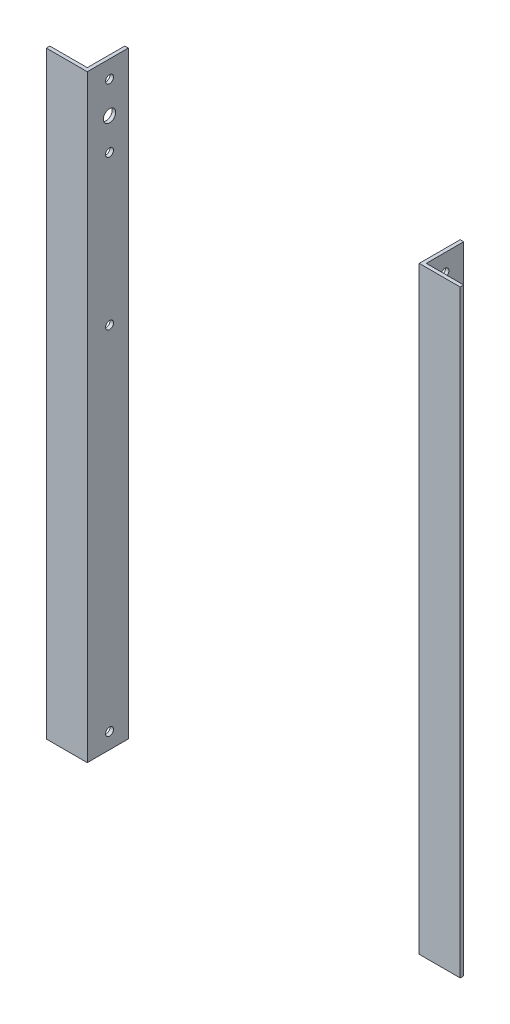
ISO-10303-21;
HEADER;
FILE_DESCRIPTION(('STEP AP214'),'2;1');
FILE_NAME('part.step','',(''),(''),'','','');
FILE_SCHEMA(('AUTOMOTIVE_DESIGN { 1 0 10303 214 1 1 1 1 }'));
ENDSEC;
DATA;
#1=APPLICATION_CONTEXT('core data for automotive mechanical design processes');
#2=APPLICATION_PROTOCOL_DEFINITION('international standard','automotive_design',2000,#1);
#3=PRODUCT_CONTEXT('',#1,'mechanical');
#4=PRODUCT('Part','Part','',(#3));
#5=PRODUCT_RELATED_PRODUCT_CATEGORY('part','',(#4));
#6=PRODUCT_DEFINITION_FORMATION('','',#4);
#7=PRODUCT_DEFINITION_CONTEXT('part definition',#1,'design');
#8=PRODUCT_DEFINITION('design','',#6,#7);
#9=PRODUCT_DEFINITION_SHAPE('','',#8);
#10=(LENGTH_UNIT() NAMED_UNIT(*) SI_UNIT(.MILLI.,.METRE.));
#11=(NAMED_UNIT(*) PLANE_ANGLE_UNIT() SI_UNIT($,.RADIAN.));
#12=(NAMED_UNIT(*) SI_UNIT($,.STERADIAN.) SOLID_ANGLE_UNIT());
#13=UNCERTAINTY_MEASURE_WITH_UNIT(LENGTH_MEASURE(1.E-05),#10,'distance_accuracy_value','');
#14=(GEOMETRIC_REPRESENTATION_CONTEXT(3) GLOBAL_UNCERTAINTY_ASSIGNED_CONTEXT((#13)) GLOBAL_UNIT_ASSIGNED_CONTEXT((#10,
#11,#12)) REPRESENTATION_CONTEXT('',''));
#15=CARTESIAN_POINT('',(0.,0.,0.));
#16=DIRECTION('',(0.,0.,1.));
#17=DIRECTION('',(1.,0.,0.));
#18=AXIS2_PLACEMENT_3D('',#15,#16,#17);
#19=CARTESIAN_POINT('',(190.6,340.,-2.));
#20=DIRECTION('',(0.,0.,1.));
#21=DIRECTION('',(1.,0.,0.));
#22=AXIS2_PLACEMENT_3D('',#19,#20,#21);
#23=PLANE('',#22);
#24=DIRECTION('',(-1.,0.,0.));
#25=VECTOR('',#24,1.);
#26=CARTESIAN_POINT('',(190.6,0.,-2.));
#27=LINE('',#26,#25);
#28=CARTESIAN_POINT('',(211.9,0.,-2.));
#29=VERTEX_POINT('',#28);
#30=CARTESIAN_POINT('',(190.6,0.,-2.));
#31=VERTEX_POINT('',#30);
#32=EDGE_CURVE('E132',#29,#31,#27,.T.);
#33=ORIENTED_EDGE('',*,*,#32,.T.);
#34=DIRECTION('',(0.,-1.,0.));
#35=VECTOR('',#34,1.);
#36=CARTESIAN_POINT('',(190.6,340.,-2.));
#37=LINE('',#36,#35);
#38=CARTESIAN_POINT('',(190.6,340.,-2.));
#39=VERTEX_POINT('',#38);
#40=EDGE_CURVE('E12',#39,#31,#37,.T.);
#41=ORIENTED_EDGE('',*,*,#40,.F.);
#42=DIRECTION('',(-1.,0.,0.));
#43=VECTOR('',#42,1.);
#44=CARTESIAN_POINT('',(190.6,340.,-2.));
#45=LINE('',#44,#43);
#46=CARTESIAN_POINT('',(211.9,340.,-2.));
#47=VERTEX_POINT('',#46);
#48=EDGE_CURVE('E143',#47,#39,#45,.T.);
#49=ORIENTED_EDGE('',*,*,#48,.F.);
#50=DIRECTION('',(0.,-1.,0.));
#51=VECTOR('',#50,1.);
#52=CARTESIAN_POINT('',(211.9,340.,-2.));
#53=LINE('',#52,#51);
#54=EDGE_CURVE('E128',#47,#29,#53,.T.);
#55=ORIENTED_EDGE('',*,*,#54,.T.);
#56=EDGE_LOOP('',(#33,#41,#49,#55));
#57=FACE_BOUND('',#56,.T.);
#58=ADVANCED_FACE('F46',(#57),#23,.F.);
#59=CARTESIAN_POINT('',(190.6,340.,-23.3));
#60=DIRECTION('',(-1.,0.,0.));
#61=DIRECTION('',(0.,0.,1.));
#62=AXIS2_PLACEMENT_3D('',#59,#60,#61);
#63=PLANE('',#62);
#64=CARTESIAN_POINT('',(190.6,330.,-12.65));
#65=DIRECTION('',(-1.,0.,0.));
#66=DIRECTION('',(0.,0.,1.));
#67=AXIS2_PLACEMENT_3D('',#64,#65,#66);
#68=CIRCLE('',#67,2.25);
#69=CARTESIAN_POINT('',(190.6,330.,-10.4));
#70=VERTEX_POINT('',#69);
#71=EDGE_CURVE('E171',#70,#70,#68,.T.);
#72=ORIENTED_EDGE('',*,*,#71,.T.);
#73=EDGE_LOOP('',(#72));
#74=FACE_BOUND('',#73,.T.);
#75=CARTESIAN_POINT('',(190.6,294.,-12.65));
#76=DIRECTION('',(-1.,0.,0.));
#77=DIRECTION('',(0.,0.,1.));
#78=AXIS2_PLACEMENT_3D('',#75,#76,#77);
#79=CIRCLE('',#78,2.25);
#80=CARTESIAN_POINT('',(190.6,294.,-10.4));
#81=VERTEX_POINT('',#80);
#82=EDGE_CURVE('E161',#81,#81,#79,.T.);
#83=ORIENTED_EDGE('',*,*,#82,.T.);
#84=EDGE_LOOP('',(#83));
#85=FACE_BOUND('',#84,.T.);
#86=CARTESIAN_POINT('',(190.6,312.,-12.65));
#87=DIRECTION('',(-1.,0.,0.));
#88=DIRECTION('',(0.,0.,1.));
#89=AXIS2_PLACEMENT_3D('',#86,#87,#88);
#90=CIRCLE('',#89,3.5);
#91=CARTESIAN_POINT('',(190.6,312.,-9.15));
#92=VERTEX_POINT('',#91);
#93=EDGE_CURVE('E158',#92,#92,#90,.T.);
#94=ORIENTED_EDGE('',*,*,#93,.T.);
#95=EDGE_LOOP('',(#94));
#96=FACE_BOUND('',#95,.T.);
#97=CARTESIAN_POINT('',(190.6,209.,-12.65));
#98=DIRECTION('',(1.,0.,0.));
#99=DIRECTION('',(0.,0.,-1.));
#100=AXIS2_PLACEMENT_3D('',#97,#98,#99);
#101=CIRCLE('',#100,2.25);
#102=CARTESIAN_POINT('',(190.6,209.,-14.9));
#103=VERTEX_POINT('',#102);
#104=EDGE_CURVE('E155',#103,#103,#101,.T.);
#105=ORIENTED_EDGE('',*,*,#104,.F.);
#106=EDGE_LOOP('',(#105));
#107=FACE_BOUND('',#106,.T.);
#108=CARTESIAN_POINT('',(190.6,9.,-12.65));
#109=DIRECTION('',(1.,0.,0.));
#110=DIRECTION('',(0.,0.,-1.));
#111=AXIS2_PLACEMENT_3D('',#108,#109,#110);
#112=CIRCLE('',#111,2.25);
#113=CARTESIAN_POINT('',(190.6,9.,-14.9));
#114=VERTEX_POINT('',#113);
#115=EDGE_CURVE('E151',#114,#114,#112,.T.);
#116=ORIENTED_EDGE('',*,*,#115,.F.);
#117=EDGE_LOOP('',(#116));
#118=FACE_BOUND('',#117,.T.);
#119=DIRECTION('',(0.,0.,-1.));
#120=VECTOR('',#119,1.);
#121=CARTESIAN_POINT('',(190.6,0.,-23.3));
#122=LINE('',#121,#120);
#123=CARTESIAN_POINT('',(190.6,0.,-23.3));
#124=VERTEX_POINT('',#123);
#125=EDGE_CURVE('E135',#31,#124,#122,.T.);
#126=ORIENTED_EDGE('',*,*,#125,.T.);
#127=DIRECTION('',(0.,-1.,0.));
#128=VECTOR('',#127,1.);
#129=CARTESIAN_POINT('',(190.6,340.,-23.3));
#130=LINE('',#129,#128);
#131=CARTESIAN_POINT('',(190.6,340.,-23.3));
#132=VERTEX_POINT('',#131);
#133=EDGE_CURVE('E55',#132,#124,#130,.T.);
#134=ORIENTED_EDGE('',*,*,#133,.F.);
#135=DIRECTION('',(0.,0.,-1.));
#136=VECTOR('',#135,1.);
#137=CARTESIAN_POINT('',(190.6,340.,-23.3));
#138=LINE('',#137,#136);
#139=EDGE_CURVE('E101',#39,#132,#138,.T.);
#140=ORIENTED_EDGE('',*,*,#139,.F.);
#141=ORIENTED_EDGE('',*,*,#40,.T.);
#142=EDGE_LOOP('',(#126,#134,#140,#141));
#143=FACE_BOUND('',#142,.T.);
#144=ADVANCED_FACE('F181',(#74,#85,#96,#107,#118,#143),#63,.F.);
#145=CARTESIAN_POINT('',(188.6,340.,-23.3));
#146=DIRECTION('',(0.,0.,1.));
#147=DIRECTION('',(1.,0.,0.));
#148=AXIS2_PLACEMENT_3D('',#145,#146,#147);
#149=PLANE('',#148);
#150=DIRECTION('',(-1.,0.,0.));
#151=VECTOR('',#150,1.);
#152=CARTESIAN_POINT('',(188.6,0.,-23.3));
#153=LINE('',#152,#151);
#154=CARTESIAN_POINT('',(188.6,0.,-23.3));
#155=VERTEX_POINT('',#154);
#156=EDGE_CURVE('E138',#124,#155,#153,.T.);
#157=ORIENTED_EDGE('',*,*,#156,.T.);
#158=DIRECTION('',(0.,-1.,0.));
#159=VECTOR('',#158,1.);
#160=CARTESIAN_POINT('',(188.6,340.,-23.3));
#161=LINE('',#160,#159);
#162=CARTESIAN_POINT('',(188.6,340.,-23.3));
#163=VERTEX_POINT('',#162);
#164=EDGE_CURVE('E123',#163,#155,#161,.T.);
#165=ORIENTED_EDGE('',*,*,#164,.F.);
#166=DIRECTION('',(-1.,0.,0.));
#167=VECTOR('',#166,1.);
#168=CARTESIAN_POINT('',(188.6,340.,-23.3));
#169=LINE('',#168,#167);
#170=EDGE_CURVE('E114',#132,#163,#169,.T.);
#171=ORIENTED_EDGE('',*,*,#170,.F.);
#172=ORIENTED_EDGE('',*,*,#133,.T.);
#173=EDGE_LOOP('',(#157,#165,#171,#172));
#174=FACE_BOUND('',#173,.T.);
#175=ADVANCED_FACE('F184',(#174),#149,.F.);
#176=CARTESIAN_POINT('',(188.6,340.,0.));
#177=DIRECTION('',(1.,0.,0.));
#178=DIRECTION('',(0.,0.,-1.));
#179=AXIS2_PLACEMENT_3D('',#176,#177,#178);
#180=PLANE('',#179);
#181=CARTESIAN_POINT('',(188.6,330.,-12.65));
#182=DIRECTION('',(1.,0.,0.));
#183=DIRECTION('',(0.,0.,-1.));
#184=AXIS2_PLACEMENT_3D('',#181,#182,#183);
#185=CIRCLE('',#184,2.25);
#186=CARTESIAN_POINT('',(188.6,330.,-14.9));
#187=VERTEX_POINT('',#186);
#188=EDGE_CURVE('E49',#187,#187,#185,.T.);
#189=ORIENTED_EDGE('',*,*,#188,.T.);
#190=EDGE_LOOP('',(#189));
#191=FACE_BOUND('',#190,.T.);
#192=CARTESIAN_POINT('',(188.6,294.,-12.65));
#193=DIRECTION('',(1.,0.,0.));
#194=DIRECTION('',(0.,0.,-1.));
#195=AXIS2_PLACEMENT_3D('',#192,#193,#194);
#196=CIRCLE('',#195,2.25);
#197=CARTESIAN_POINT('',(188.6,294.,-14.9));
#198=VERTEX_POINT('',#197);
#199=EDGE_CURVE('E159',#198,#198,#196,.T.);
#200=ORIENTED_EDGE('',*,*,#199,.T.);
#201=EDGE_LOOP('',(#200));
#202=FACE_BOUND('',#201,.T.);
#203=CARTESIAN_POINT('',(188.6,312.,-12.65));
#204=DIRECTION('',(1.,0.,0.));
#205=DIRECTION('',(0.,0.,-1.));
#206=AXIS2_PLACEMENT_3D('',#203,#204,#205);
#207=CIRCLE('',#206,3.5);
#208=CARTESIAN_POINT('',(188.6,312.,-16.15));
#209=VERTEX_POINT('',#208);
#210=EDGE_CURVE('E156',#209,#209,#207,.T.);
#211=ORIENTED_EDGE('',*,*,#210,.T.);
#212=EDGE_LOOP('',(#211));
#213=FACE_BOUND('',#212,.T.);
#214=CARTESIAN_POINT('',(188.6,209.,-12.65));
#215=DIRECTION('',(1.,0.,0.));
#216=DIRECTION('',(0.,0.,-1.));
#217=AXIS2_PLACEMENT_3D('',#214,#215,#216);
#218=CIRCLE('',#217,2.25);
#219=CARTESIAN_POINT('',(188.6,209.,-14.9));
#220=VERTEX_POINT('',#219);
#221=EDGE_CURVE('E152',#220,#220,#218,.T.);
#222=ORIENTED_EDGE('',*,*,#221,.T.);
#223=EDGE_LOOP('',(#222));
#224=FACE_BOUND('',#223,.T.);
#225=CARTESIAN_POINT('',(188.6,9.,-12.65));
#226=DIRECTION('',(1.,0.,0.));
#227=DIRECTION('',(0.,0.,-1.));
#228=AXIS2_PLACEMENT_3D('',#225,#226,#227);
#229=CIRCLE('',#228,2.25);
#230=CARTESIAN_POINT('',(188.6,9.,-14.9));
#231=VERTEX_POINT('',#230);
#232=EDGE_CURVE('E136',#231,#231,#229,.T.);
#233=ORIENTED_EDGE('',*,*,#232,.T.);
#234=EDGE_LOOP('',(#233));
#235=FACE_BOUND('',#234,.T.);
#236=DIRECTION('',(0.,0.,1.));
#237=VECTOR('',#236,1.);
#238=CARTESIAN_POINT('',(188.6,0.,0.));
#239=LINE('',#238,#237);
#240=CARTESIAN_POINT('',(188.6,0.,0.));
#241=VERTEX_POINT('',#240);
#242=EDGE_CURVE('E122',#155,#241,#239,.T.);
#243=ORIENTED_EDGE('',*,*,#242,.T.);
#244=DIRECTION('',(0.,-1.,0.));
#245=VECTOR('',#244,1.);
#246=CARTESIAN_POINT('',(188.6,340.,0.));
#247=LINE('',#246,#245);
#248=CARTESIAN_POINT('',(188.6,340.,0.));
#249=VERTEX_POINT('',#248);
#250=EDGE_CURVE('E119',#249,#241,#247,.T.);
#251=ORIENTED_EDGE('',*,*,#250,.F.);
#252=DIRECTION('',(0.,0.,1.));
#253=VECTOR('',#252,1.);
#254=CARTESIAN_POINT('',(188.6,340.,0.));
#255=LINE('',#254,#253);
#256=EDGE_CURVE('E108',#163,#249,#255,.T.);
#257=ORIENTED_EDGE('',*,*,#256,.F.);
#258=ORIENTED_EDGE('',*,*,#164,.T.);
#259=EDGE_LOOP('',(#243,#251,#257,#258));
#260=FACE_BOUND('',#259,.T.);
#261=ADVANCED_FACE('F120',(#191,#202,#213,#224,#235,#260),#180,.F.);
#262=CARTESIAN_POINT('',(211.9,340.,0.));
#263=DIRECTION('',(0.,0.,-1.));
#264=DIRECTION('',(-1.,0.,0.));
#265=AXIS2_PLACEMENT_3D('',#262,#263,#264);
#266=PLANE('',#265);
#267=DIRECTION('',(1.,0.,0.));
#268=VECTOR('',#267,1.);
#269=CARTESIAN_POINT('',(211.9,0.,0.));
#270=LINE('',#269,#268);
#271=CARTESIAN_POINT('',(211.9,0.,0.));
#272=VERTEX_POINT('',#271);
#273=EDGE_CURVE('E87',#241,#272,#270,.T.);
#274=ORIENTED_EDGE('',*,*,#273,.T.);
#275=DIRECTION('',(0.,-1.,0.));
#276=VECTOR('',#275,1.);
#277=CARTESIAN_POINT('',(211.9,340.,0.));
#278=LINE('',#277,#276);
#279=CARTESIAN_POINT('',(211.9,340.,0.));
#280=VERTEX_POINT('',#279);
#281=EDGE_CURVE('E124',#280,#272,#278,.T.);
#282=ORIENTED_EDGE('',*,*,#281,.F.);
#283=DIRECTION('',(1.,0.,0.));
#284=VECTOR('',#283,1.);
#285=CARTESIAN_POINT('',(211.9,340.,0.));
#286=LINE('',#285,#284);
#287=EDGE_CURVE('E112',#249,#280,#286,.T.);
#288=ORIENTED_EDGE('',*,*,#287,.F.);
#289=ORIENTED_EDGE('',*,*,#250,.T.);
#290=EDGE_LOOP('',(#274,#282,#288,#289));
#291=FACE_BOUND('',#290,.T.);
#292=ADVANCED_FACE('F126',(#291),#266,.F.);
#293=CARTESIAN_POINT('',(211.9,340.,-2.));
#294=DIRECTION('',(-1.,0.,0.));
#295=DIRECTION('',(0.,0.,1.));
#296=AXIS2_PLACEMENT_3D('',#293,#294,#295);
#297=PLANE('',#296);
#298=DIRECTION('',(0.,0.,-1.));
#299=VECTOR('',#298,1.);
#300=CARTESIAN_POINT('',(211.9,0.,-2.));
#301=LINE('',#300,#299);
#302=EDGE_CURVE('E93',#272,#29,#301,.T.);
#303=ORIENTED_EDGE('',*,*,#302,.T.);
#304=ORIENTED_EDGE('',*,*,#54,.F.);
#305=DIRECTION('',(0.,0.,-1.));
#306=VECTOR('',#305,1.);
#307=CARTESIAN_POINT('',(211.9,340.,-2.));
#308=LINE('',#307,#306);
#309=EDGE_CURVE('E64',#280,#47,#308,.T.);
#310=ORIENTED_EDGE('',*,*,#309,.F.);
#311=ORIENTED_EDGE('',*,*,#281,.T.);
#312=EDGE_LOOP('',(#303,#304,#310,#311));
#313=FACE_BOUND('',#312,.T.);
#314=ADVANCED_FACE('F189',(#313),#297,.F.);
#315=CARTESIAN_POINT('',(0.,340.,0.));
#316=DIRECTION('',(0.,-1.,0.));
#317=DIRECTION('',(0.,0.,-1.));
#318=AXIS2_PLACEMENT_3D('',#315,#316,#317);
#319=PLANE('',#318);
#320=ORIENTED_EDGE('',*,*,#48,.T.);
#321=ORIENTED_EDGE('',*,*,#139,.T.);
#322=ORIENTED_EDGE('',*,*,#170,.T.);
#323=ORIENTED_EDGE('',*,*,#256,.T.);
#324=ORIENTED_EDGE('',*,*,#287,.T.);
#325=ORIENTED_EDGE('',*,*,#309,.T.);
#326=EDGE_LOOP('',(#320,#321,#322,#323,#324,#325));
#327=FACE_BOUND('',#326,.T.);
#328=ADVANCED_FACE('F110',(#327),#319,.F.);
#329=CARTESIAN_POINT('',(0.,0.,0.));
#330=DIRECTION('',(0.,-1.,0.));
#331=DIRECTION('',(0.,0.,-1.));
#332=AXIS2_PLACEMENT_3D('',#329,#330,#331);
#333=PLANE('',#332);
#334=ORIENTED_EDGE('',*,*,#32,.F.);
#335=ORIENTED_EDGE('',*,*,#302,.F.);
#336=ORIENTED_EDGE('',*,*,#273,.F.);
#337=ORIENTED_EDGE('',*,*,#242,.F.);
#338=ORIENTED_EDGE('',*,*,#156,.F.);
#339=ORIENTED_EDGE('',*,*,#125,.F.);
#340=EDGE_LOOP('',(#334,#335,#336,#337,#338,#339));
#341=FACE_BOUND('',#340,.T.);
#342=ADVANCED_FACE('F187',(#341),#333,.T.);
#343=CARTESIAN_POINT('',(-24.4,9.,-12.65));
#344=DIRECTION('',(1.,0.,0.));
#345=DIRECTION('',(0.,0.,-1.));
#346=AXIS2_PLACEMENT_3D('',#343,#344,#345);
#347=CYLINDRICAL_SURFACE('',#346,2.25);
#348=CARTESIAN_POINT('',(190.6,9.,-14.9));
#349=CARTESIAN_POINT('',(190.579166666667,9.,-14.9));
#350=CARTESIAN_POINT('',(190.558333333333,9.,-14.9));
#351=CARTESIAN_POINT('',(190.516666666667,9.,-14.9));
#352=CARTESIAN_POINT('',(190.495833333333,9.,-14.9));
#353=CARTESIAN_POINT('',(190.454166666667,9.,-14.9));
#354=CARTESIAN_POINT('',(190.433333333333,9.,-14.9));
#355=CARTESIAN_POINT('',(190.391666666667,9.,-14.9));
#356=CARTESIAN_POINT('',(190.370833333333,9.,-14.9));
#357=CARTESIAN_POINT('',(190.329166666667,9.,-14.9));
#358=CARTESIAN_POINT('',(190.308333333333,9.,-14.9));
#359=CARTESIAN_POINT('',(190.266666666667,9.,-14.9));
#360=CARTESIAN_POINT('',(190.245833333333,9.,-14.9));
#361=CARTESIAN_POINT('',(190.204166666667,9.,-14.9));
#362=CARTESIAN_POINT('',(190.183333333333,9.,-14.9));
#363=CARTESIAN_POINT('',(190.141666666667,9.,-14.9));
#364=CARTESIAN_POINT('',(190.120833333333,9.,-14.9));
#365=CARTESIAN_POINT('',(190.079166666667,9.,-14.9));
#366=CARTESIAN_POINT('',(190.058333333333,9.,-14.9));
#367=CARTESIAN_POINT('',(190.016666666667,9.,-14.9));
#368=CARTESIAN_POINT('',(189.995833333333,9.,-14.9));
#369=CARTESIAN_POINT('',(189.954166666667,9.,-14.9));
#370=CARTESIAN_POINT('',(189.933333333333,9.,-14.9));
#371=CARTESIAN_POINT('',(189.891666666667,9.,-14.9));
#372=CARTESIAN_POINT('',(189.870833333333,9.,-14.9));
#373=CARTESIAN_POINT('',(189.829166666667,9.,-14.9));
#374=CARTESIAN_POINT('',(189.808333333333,9.,-14.9));
#375=CARTESIAN_POINT('',(189.766666666667,9.,-14.9));
#376=CARTESIAN_POINT('',(189.745833333333,9.,-14.9));
#377=CARTESIAN_POINT('',(189.704166666667,9.,-14.9));
#378=CARTESIAN_POINT('',(189.683333333333,9.,-14.9));
#379=CARTESIAN_POINT('',(189.641666666667,9.,-14.9));
#380=CARTESIAN_POINT('',(189.620833333333,9.,-14.9));
#381=CARTESIAN_POINT('',(189.579166666667,9.,-14.9));
#382=CARTESIAN_POINT('',(189.558333333333,9.,-14.9));
#383=CARTESIAN_POINT('',(189.516666666667,9.,-14.9));
#384=CARTESIAN_POINT('',(189.495833333333,9.,-14.9));
#385=CARTESIAN_POINT('',(189.454166666667,9.,-14.9));
#386=CARTESIAN_POINT('',(189.433333333333,9.,-14.9));
#387=CARTESIAN_POINT('',(189.391666666667,9.,-14.9));
#388=CARTESIAN_POINT('',(189.370833333333,9.,-14.9));
#389=CARTESIAN_POINT('',(189.329166666667,9.,-14.9));
#390=CARTESIAN_POINT('',(189.308333333333,9.,-14.9));
#391=CARTESIAN_POINT('',(189.266666666667,9.,-14.9));
#392=CARTESIAN_POINT('',(189.245833333333,9.,-14.9));
#393=CARTESIAN_POINT('',(189.204166666667,9.,-14.9));
#394=CARTESIAN_POINT('',(189.183333333333,9.,-14.9));
#395=CARTESIAN_POINT('',(189.141666666667,9.,-14.9));
#396=CARTESIAN_POINT('',(189.120833333333,9.,-14.9));
#397=CARTESIAN_POINT('',(189.079166666667,9.,-14.9));
#398=CARTESIAN_POINT('',(189.058333333333,9.,-14.9));
#399=CARTESIAN_POINT('',(189.016666666667,9.,-14.9));
#400=CARTESIAN_POINT('',(188.995833333333,9.,-14.9));
#401=CARTESIAN_POINT('',(188.954166666667,9.,-14.9));
#402=CARTESIAN_POINT('',(188.933333333333,9.,-14.9));
#403=CARTESIAN_POINT('',(188.891666666667,9.,-14.9));
#404=CARTESIAN_POINT('',(188.870833333333,9.,-14.9));
#405=CARTESIAN_POINT('',(188.829166666667,9.,-14.9));
#406=CARTESIAN_POINT('',(188.808333333333,9.,-14.9));
#407=CARTESIAN_POINT('',(188.766666666667,9.,-14.9));
#408=CARTESIAN_POINT('',(188.745833333333,9.,-14.9));
#409=CARTESIAN_POINT('',(188.704166666667,9.,-14.9));
#410=CARTESIAN_POINT('',(188.683333333333,9.,-14.9));
#411=CARTESIAN_POINT('',(188.641666666667,9.,-14.9));
#412=CARTESIAN_POINT('',(188.620833333333,9.,-14.9));
#413=CARTESIAN_POINT('',(188.6,9.,-14.9));
#414=B_SPLINE_CURVE_WITH_KNOTS('',3,(#348,#349,#350,#351,#352,#353,#354,#355,#356,#357,#358,
#359,#360,#361,#362,#363,#364,#365,#366,#367,#368,#369,#370,#371,#372,#373,#374,#375,#376,#377,
#378,#379,#380,#381,#382,#383,#384,#385,#386,#387,#388,#389,#390,#391,#392,#393,#394,#395,#396,
#397,#398,#399,#400,#401,#402,#403,#404,#405,#406,#407,#408,#409,#410,#411,#412,#413),
.UNSPECIFIED.,.F.,.F.,(4,2,2,2,2,2,2,2,2,2,2,2,2,2,2,2,2,2,2,2,2,2,2,2,2,2,2,2,2,2,2,2,4),(0.,
0.0624999999999931,0.124999999999986,0.187500000000007,0.25,0.312499999999993,0.375000000000014,
0.437500000000007,0.5,0.562499999999994,0.624999999999987,0.687500000000008,0.750000000000001,
0.812499999999994,0.875000000000015,0.937500000000008,1.,1.06249999999999,1.12499999999999,
1.18750000000001,1.25,1.31249999999999,1.37500000000002,1.43750000000001,1.5,1.56249999999999,
1.62499999999999,1.68750000000001,1.75,1.81249999999999,1.87500000000002,1.93750000000001,2.),.UNSPECIFIED.);
#415=EDGE_CURVE('BSEAM225',#114,#231,#414,.T.);
#416=ORIENTED_EDGE('',*,*,#115,.T.);
#417=ORIENTED_EDGE('',*,*,#232,.F.);
#418=ORIENTED_EDGE('',*,*,#415,.T.);
#419=ORIENTED_EDGE('',*,*,#415,.F.);
#420=EDGE_LOOP('',(#416,#418,#417,#419));
#421=FACE_BOUND('',#420,.T.);
#422=ADVANCED_FACE('F225',(#421),#347,.F.);
#423=CARTESIAN_POINT('',(-24.4,209.,-12.65));
#424=DIRECTION('',(1.,0.,0.));
#425=DIRECTION('',(0.,0.,-1.));
#426=AXIS2_PLACEMENT_3D('',#423,#424,#425);
#427=CYLINDRICAL_SURFACE('',#426,2.25);
#428=CARTESIAN_POINT('',(190.6,209.,-14.9));
#429=CARTESIAN_POINT('',(190.579166666667,209.,-14.9));
#430=CARTESIAN_POINT('',(190.558333333333,209.,-14.9));
#431=CARTESIAN_POINT('',(190.516666666667,209.,-14.9));
#432=CARTESIAN_POINT('',(190.495833333333,209.,-14.9));
#433=CARTESIAN_POINT('',(190.454166666667,209.,-14.9));
#434=CARTESIAN_POINT('',(190.433333333333,209.,-14.9));
#435=CARTESIAN_POINT('',(190.391666666667,209.,-14.9));
#436=CARTESIAN_POINT('',(190.370833333333,209.,-14.9));
#437=CARTESIAN_POINT('',(190.329166666667,209.,-14.9));
#438=CARTESIAN_POINT('',(190.308333333333,209.,-14.9));
#439=CARTESIAN_POINT('',(190.266666666667,209.,-14.9));
#440=CARTESIAN_POINT('',(190.245833333333,209.,-14.9));
#441=CARTESIAN_POINT('',(190.204166666667,209.,-14.9));
#442=CARTESIAN_POINT('',(190.183333333333,209.,-14.9));
#443=CARTESIAN_POINT('',(190.141666666667,209.,-14.9));
#444=CARTESIAN_POINT('',(190.120833333333,209.,-14.9));
#445=CARTESIAN_POINT('',(190.079166666667,209.,-14.9));
#446=CARTESIAN_POINT('',(190.058333333333,209.,-14.9));
#447=CARTESIAN_POINT('',(190.016666666667,209.,-14.9));
#448=CARTESIAN_POINT('',(189.995833333333,209.,-14.9));
#449=CARTESIAN_POINT('',(189.954166666667,209.,-14.9));
#450=CARTESIAN_POINT('',(189.933333333333,209.,-14.9));
#451=CARTESIAN_POINT('',(189.891666666667,209.,-14.9));
#452=CARTESIAN_POINT('',(189.870833333333,209.,-14.9));
#453=CARTESIAN_POINT('',(189.829166666667,209.,-14.9));
#454=CARTESIAN_POINT('',(189.808333333333,209.,-14.9));
#455=CARTESIAN_POINT('',(189.766666666667,209.,-14.9));
#456=CARTESIAN_POINT('',(189.745833333333,209.,-14.9));
#457=CARTESIAN_POINT('',(189.704166666667,209.,-14.9));
#458=CARTESIAN_POINT('',(189.683333333333,209.,-14.9));
#459=CARTESIAN_POINT('',(189.641666666667,209.,-14.9));
#460=CARTESIAN_POINT('',(189.620833333333,209.,-14.9));
#461=CARTESIAN_POINT('',(189.579166666667,209.,-14.9));
#462=CARTESIAN_POINT('',(189.558333333333,209.,-14.9));
#463=CARTESIAN_POINT('',(189.516666666667,209.,-14.9));
#464=CARTESIAN_POINT('',(189.495833333333,209.,-14.9));
#465=CARTESIAN_POINT('',(189.454166666667,209.,-14.9));
#466=CARTESIAN_POINT('',(189.433333333333,209.,-14.9));
#467=CARTESIAN_POINT('',(189.391666666667,209.,-14.9));
#468=CARTESIAN_POINT('',(189.370833333333,209.,-14.9));
#469=CARTESIAN_POINT('',(189.329166666667,209.,-14.9));
#470=CARTESIAN_POINT('',(189.308333333333,209.,-14.9));
#471=CARTESIAN_POINT('',(189.266666666667,209.,-14.9));
#472=CARTESIAN_POINT('',(189.245833333333,209.,-14.9));
#473=CARTESIAN_POINT('',(189.204166666667,209.,-14.9));
#474=CARTESIAN_POINT('',(189.183333333333,209.,-14.9));
#475=CARTESIAN_POINT('',(189.141666666667,209.,-14.9));
#476=CARTESIAN_POINT('',(189.120833333333,209.,-14.9));
#477=CARTESIAN_POINT('',(189.079166666667,209.,-14.9));
#478=CARTESIAN_POINT('',(189.058333333333,209.,-14.9));
#479=CARTESIAN_POINT('',(189.016666666667,209.,-14.9));
#480=CARTESIAN_POINT('',(188.995833333333,209.,-14.9));
#481=CARTESIAN_POINT('',(188.954166666667,209.,-14.9));
#482=CARTESIAN_POINT('',(188.933333333333,209.,-14.9));
#483=CARTESIAN_POINT('',(188.891666666667,209.,-14.9));
#484=CARTESIAN_POINT('',(188.870833333333,209.,-14.9));
#485=CARTESIAN_POINT('',(188.829166666667,209.,-14.9));
#486=CARTESIAN_POINT('',(188.808333333333,209.,-14.9));
#487=CARTESIAN_POINT('',(188.766666666667,209.,-14.9));
#488=CARTESIAN_POINT('',(188.745833333333,209.,-14.9));
#489=CARTESIAN_POINT('',(188.704166666667,209.,-14.9));
#490=CARTESIAN_POINT('',(188.683333333333,209.,-14.9));
#491=CARTESIAN_POINT('',(188.641666666667,209.,-14.9));
#492=CARTESIAN_POINT('',(188.620833333333,209.,-14.9));
#493=CARTESIAN_POINT('',(188.6,209.,-14.9));
#494=B_SPLINE_CURVE_WITH_KNOTS('',3,(#428,#429,#430,#431,#432,#433,#434,#435,#436,#437,#438,
#439,#440,#441,#442,#443,#444,#445,#446,#447,#448,#449,#450,#451,#452,#453,#454,#455,#456,#457,
#458,#459,#460,#461,#462,#463,#464,#465,#466,#467,#468,#469,#470,#471,#472,#473,#474,#475,#476,
#477,#478,#479,#480,#481,#482,#483,#484,#485,#486,#487,#488,#489,#490,#491,#492,#493),
.UNSPECIFIED.,.F.,.F.,(4,2,2,2,2,2,2,2,2,2,2,2,2,2,2,2,2,2,2,2,2,2,2,2,2,2,2,2,2,2,2,2,4),(0.,
0.0624999999999931,0.124999999999986,0.187500000000007,0.25,0.312499999999993,0.375000000000014,
0.437500000000007,0.5,0.562499999999994,0.624999999999987,0.687500000000008,0.750000000000001,
0.812499999999994,0.875000000000015,0.937500000000008,1.,1.06249999999999,1.12499999999999,
1.18750000000001,1.25,1.31249999999999,1.37500000000002,1.43750000000001,1.5,1.56249999999999,
1.62499999999999,1.68750000000001,1.75,1.81249999999999,1.87500000000002,1.93750000000001,2.),.UNSPECIFIED.);
#495=EDGE_CURVE('BSEAM227',#103,#220,#494,.T.);
#496=ORIENTED_EDGE('',*,*,#104,.T.);
#497=ORIENTED_EDGE('',*,*,#221,.F.);
#498=ORIENTED_EDGE('',*,*,#495,.T.);
#499=ORIENTED_EDGE('',*,*,#495,.F.);
#500=EDGE_LOOP('',(#496,#498,#497,#499));
#501=FACE_BOUND('',#500,.T.);
#502=ADVANCED_FACE('F227',(#501),#427,.F.);
#503=CARTESIAN_POINT('',(197.,312.,-12.65));
#504=DIRECTION('',(-1.,0.,0.));
#505=DIRECTION('',(0.,0.,1.));
#506=AXIS2_PLACEMENT_3D('',#503,#504,#505);
#507=CYLINDRICAL_SURFACE('',#506,3.5);
#508=ORIENTED_EDGE('',*,*,#210,.F.);
#509=EDGE_LOOP('',(#508));
#510=FACE_BOUND('',#509,.T.);
#511=ORIENTED_EDGE('',*,*,#93,.F.);
#512=EDGE_LOOP('',(#511));
#513=FACE_BOUND('',#512,.T.);
#514=ADVANCED_FACE('F234',(#510,#513),#507,.F.);
#515=CARTESIAN_POINT('',(197.,294.,-12.65));
#516=DIRECTION('',(-1.,0.,0.));
#517=DIRECTION('',(0.,0.,1.));
#518=AXIS2_PLACEMENT_3D('',#515,#516,#517);
#519=CYLINDRICAL_SURFACE('',#518,2.25);
#520=ORIENTED_EDGE('',*,*,#199,.F.);
#521=EDGE_LOOP('',(#520));
#522=FACE_BOUND('',#521,.T.);
#523=ORIENTED_EDGE('',*,*,#82,.F.);
#524=EDGE_LOOP('',(#523));
#525=FACE_BOUND('',#524,.T.);
#526=ADVANCED_FACE('F240',(#522,#525),#519,.F.);
#527=CARTESIAN_POINT('',(197.,330.,-12.65));
#528=DIRECTION('',(-1.,0.,0.));
#529=DIRECTION('',(0.,0.,1.));
#530=AXIS2_PLACEMENT_3D('',#527,#528,#529);
#531=CYLINDRICAL_SURFACE('',#530,2.25);
#532=ORIENTED_EDGE('',*,*,#188,.F.);
#533=EDGE_LOOP('',(#532));
#534=FACE_BOUND('',#533,.T.);
#535=ORIENTED_EDGE('',*,*,#71,.F.);
#536=EDGE_LOOP('',(#535));
#537=FACE_BOUND('',#536,.T.);
#538=ADVANCED_FACE('F244',(#534,#537),#531,.F.);
#539=CLOSED_SHELL('',(#58,#144,#175,#261,#292,#314,#328,#342,#422,#502,#514,#526,#538));
#540=MANIFOLD_SOLID_BREP('B2',#539);
#541=CARTESIAN_POINT('',(-23.3,340.,0.));
#542=DIRECTION('',(0.,0.,-1.));
#543=DIRECTION('',(-1.,0.,0.));
#544=AXIS2_PLACEMENT_3D('',#541,#542,#543);
#545=PLANE('',#544);
#546=DIRECTION('',(1.,0.,0.));
#547=VECTOR('',#546,1.);
#548=CARTESIAN_POINT('',(-23.3,0.,0.));
#549=LINE('',#548,#547);
#550=CARTESIAN_POINT('',(-23.3,0.,0.));
#551=VERTEX_POINT('',#550);
#552=CARTESIAN_POINT('',(0.,0.,0.));
#553=VERTEX_POINT('',#552);
#554=EDGE_CURVE('E412',#551,#553,#549,.T.);
#555=ORIENTED_EDGE('',*,*,#554,.T.);
#556=DIRECTION('',(0.,-1.,0.));
#557=VECTOR('',#556,1.);
#558=CARTESIAN_POINT('',(0.,340.,0.));
#559=LINE('',#558,#557);
#560=CARTESIAN_POINT('',(0.,340.,0.));
#561=VERTEX_POINT('',#560);
#562=EDGE_CURVE('E44',#561,#553,#559,.T.);
#563=ORIENTED_EDGE('',*,*,#562,.F.);
#564=DIRECTION('',(1.,0.,0.));
#565=VECTOR('',#564,1.);
#566=CARTESIAN_POINT('',(-23.3,340.,0.));
#567=LINE('',#566,#565);
#568=CARTESIAN_POINT('',(-23.3,340.,0.));
#569=VERTEX_POINT('',#568);
#570=EDGE_CURVE('E423',#569,#561,#567,.T.);
#571=ORIENTED_EDGE('',*,*,#570,.F.);
#572=DIRECTION('',(0.,-1.,0.));
#573=VECTOR('',#572,1.);
#574=CARTESIAN_POINT('',(-23.3,340.,0.));
#575=LINE('',#574,#573);
#576=EDGE_CURVE('E408',#569,#551,#575,.T.);
#577=ORIENTED_EDGE('',*,*,#576,.T.);
#578=EDGE_LOOP('',(#555,#563,#571,#577));
#579=FACE_BOUND('',#578,.T.);
#580=ADVANCED_FACE('F326',(#579),#545,.F.);
#581=CARTESIAN_POINT('',(0.,340.,0.));
#582=DIRECTION('',(-1.,0.,0.));
#583=DIRECTION('',(0.,0.,1.));
#584=AXIS2_PLACEMENT_3D('',#581,#582,#583);
#585=PLANE('',#584);
#586=CARTESIAN_POINT('',(0.,330.,-12.65));
#587=DIRECTION('',(-1.,0.,0.));
#588=DIRECTION('',(0.,0.,1.));
#589=AXIS2_PLACEMENT_3D('',#586,#587,#588);
#590=CIRCLE('',#589,2.25);
#591=CARTESIAN_POINT('',(0.,330.,-10.4));
#592=VERTEX_POINT('',#591);
#593=EDGE_CURVE('E440',#592,#592,#590,.T.);
#594=ORIENTED_EDGE('',*,*,#593,.T.);
#595=EDGE_LOOP('',(#594));
#596=FACE_BOUND('',#595,.T.);
#597=CARTESIAN_POINT('',(0.,294.,-12.65));
#598=DIRECTION('',(-1.,0.,0.));
#599=DIRECTION('',(0.,0.,1.));
#600=AXIS2_PLACEMENT_3D('',#597,#598,#599);
#601=CIRCLE('',#600,2.25);
#602=CARTESIAN_POINT('',(0.,294.,-10.4));
#603=VERTEX_POINT('',#602);
#604=EDGE_CURVE('E554',#603,#603,#601,.T.);
#605=ORIENTED_EDGE('',*,*,#604,.T.);
#606=EDGE_LOOP('',(#605));
#607=FACE_BOUND('',#606,.T.);
#608=CARTESIAN_POINT('',(0.,312.,-12.65));
#609=DIRECTION('',(-1.,0.,0.));
#610=DIRECTION('',(0.,0.,1.));
#611=AXIS2_PLACEMENT_3D('',#608,#609,#610);
#612=CIRCLE('',#611,3.5);
#613=CARTESIAN_POINT('',(0.,312.,-9.15));
#614=VERTEX_POINT('',#613);
#615=EDGE_CURVE('E556',#614,#614,#612,.T.);
#616=ORIENTED_EDGE('',*,*,#615,.T.);
#617=EDGE_LOOP('',(#616));
#618=FACE_BOUND('',#617,.T.);
#619=CARTESIAN_POINT('',(0.,209.,-12.65));
#620=DIRECTION('',(-1.,0.,0.));
#621=DIRECTION('',(0.,0.,1.));
#622=AXIS2_PLACEMENT_3D('',#619,#620,#621);
#623=CIRCLE('',#622,2.25);
#624=CARTESIAN_POINT('',(0.,209.,-14.9));
#625=VERTEX_POINT('',#624);
#626=EDGE_CURVE('E430',#625,#625,#623,.T.);
#627=ORIENTED_EDGE('',*,*,#626,.T.);
#628=EDGE_LOOP('',(#627));
#629=FACE_BOUND('',#628,.T.);
#630=CARTESIAN_POINT('',(0.,9.,-12.65));
#631=DIRECTION('',(-1.,0.,0.));
#632=DIRECTION('',(0.,0.,1.));
#633=AXIS2_PLACEMENT_3D('',#630,#631,#632);
#634=CIRCLE('',#633,2.25);
#635=CARTESIAN_POINT('',(0.,9.,-14.9));
#636=VERTEX_POINT('',#635);
#637=EDGE_CURVE('E416',#636,#636,#634,.T.);
#638=ORIENTED_EDGE('',*,*,#637,.T.);
#639=EDGE_LOOP('',(#638));
#640=FACE_BOUND('',#639,.T.);
#641=DIRECTION('',(0.,0.,-1.));
#642=VECTOR('',#641,1.);
#643=CARTESIAN_POINT('',(0.,0.,0.));
#644=LINE('',#643,#642);
#645=CARTESIAN_POINT('',(0.,0.,-23.3));
#646=VERTEX_POINT('',#645);
#647=EDGE_CURVE('E415',#553,#646,#644,.T.);
#648=ORIENTED_EDGE('',*,*,#647,.T.);
#649=DIRECTION('',(0.,-1.,0.));
#650=VECTOR('',#649,1.);
#651=CARTESIAN_POINT('',(0.,340.,-23.3));
#652=LINE('',#651,#650);
#653=CARTESIAN_POINT('',(0.,340.,-23.3));
#654=VERTEX_POINT('',#653);
#655=EDGE_CURVE('E335',#654,#646,#652,.T.);
#656=ORIENTED_EDGE('',*,*,#655,.F.);
#657=DIRECTION('',(0.,0.,-1.));
#658=VECTOR('',#657,1.);
#659=CARTESIAN_POINT('',(0.,340.,0.));
#660=LINE('',#659,#658);
#661=EDGE_CURVE('E381',#561,#654,#660,.T.);
#662=ORIENTED_EDGE('',*,*,#661,.F.);
#663=ORIENTED_EDGE('',*,*,#562,.T.);
#664=EDGE_LOOP('',(#648,#656,#662,#663));
#665=FACE_BOUND('',#664,.T.);
#666=ADVANCED_FACE('F447',(#596,#607,#618,#629,#640,#665),#585,.F.);
#667=CARTESIAN_POINT('',(0.,340.,-23.3));
#668=DIRECTION('',(0.,0.,1.));
#669=DIRECTION('',(1.,0.,0.));
#670=AXIS2_PLACEMENT_3D('',#667,#668,#669);
#671=PLANE('',#670);
#672=DIRECTION('',(-1.,0.,0.));
#673=VECTOR('',#672,1.);
#674=CARTESIAN_POINT('',(0.,0.,-23.3));
#675=LINE('',#674,#673);
#676=CARTESIAN_POINT('',(-2.,0.,-23.3));
#677=VERTEX_POINT('',#676);
#678=EDGE_CURVE('E418',#646,#677,#675,.T.);
#679=ORIENTED_EDGE('',*,*,#678,.T.);
#680=DIRECTION('',(0.,-1.,0.));
#681=VECTOR('',#680,1.);
#682=CARTESIAN_POINT('',(-2.,340.,-23.3));
#683=LINE('',#682,#681);
#684=CARTESIAN_POINT('',(-2.,340.,-23.3));
#685=VERTEX_POINT('',#684);
#686=EDGE_CURVE('E403',#685,#677,#683,.T.);
#687=ORIENTED_EDGE('',*,*,#686,.F.);
#688=DIRECTION('',(-1.,0.,0.));
#689=VECTOR('',#688,1.);
#690=CARTESIAN_POINT('',(0.,340.,-23.3));
#691=LINE('',#690,#689);
#692=EDGE_CURVE('E394',#654,#685,#691,.T.);
#693=ORIENTED_EDGE('',*,*,#692,.F.);
#694=ORIENTED_EDGE('',*,*,#655,.T.);
#695=EDGE_LOOP('',(#679,#687,#693,#694));
#696=FACE_BOUND('',#695,.T.);
#697=ADVANCED_FACE('F450',(#696),#671,.F.);
#698=CARTESIAN_POINT('',(-2.,340.,-23.3));
#699=DIRECTION('',(1.,0.,0.));
#700=DIRECTION('',(0.,0.,-1.));
#701=AXIS2_PLACEMENT_3D('',#698,#699,#700);
#702=PLANE('',#701);
#703=CARTESIAN_POINT('',(-2.,330.,-12.65));
#704=DIRECTION('',(-1.,0.,0.));
#705=DIRECTION('',(0.,0.,1.));
#706=AXIS2_PLACEMENT_3D('',#703,#704,#705);
#707=CIRCLE('',#706,2.25);
#708=CARTESIAN_POINT('',(-2.,330.,-10.4));
#709=VERTEX_POINT('',#708);
#710=EDGE_CURVE('E486',#709,#709,#707,.T.);
#711=ORIENTED_EDGE('',*,*,#710,.F.);
#712=EDGE_LOOP('',(#711));
#713=FACE_BOUND('',#712,.T.);
#714=CARTESIAN_POINT('',(-2.,294.,-12.65));
#715=DIRECTION('',(-1.,0.,0.));
#716=DIRECTION('',(0.,0.,1.));
#717=AXIS2_PLACEMENT_3D('',#714,#715,#716);
#718=CIRCLE('',#717,2.25);
#719=CARTESIAN_POINT('',(-2.,294.,-10.4));
#720=VERTEX_POINT('',#719);
#721=EDGE_CURVE('E490',#720,#720,#718,.T.);
#722=ORIENTED_EDGE('',*,*,#721,.F.);
#723=EDGE_LOOP('',(#722));
#724=FACE_BOUND('',#723,.T.);
#725=CARTESIAN_POINT('',(-2.,312.,-12.65));
#726=DIRECTION('',(-1.,0.,0.));
#727=DIRECTION('',(0.,0.,1.));
#728=AXIS2_PLACEMENT_3D('',#725,#726,#727);
#729=CIRCLE('',#728,3.5);
#730=CARTESIAN_POINT('',(-2.,312.,-9.15));
#731=VERTEX_POINT('',#730);
#732=EDGE_CURVE('E494',#731,#731,#729,.T.);
#733=ORIENTED_EDGE('',*,*,#732,.F.);
#734=EDGE_LOOP('',(#733));
#735=FACE_BOUND('',#734,.T.);
#736=CARTESIAN_POINT('',(-2.,209.,-12.65));
#737=DIRECTION('',(1.,0.,0.));
#738=DIRECTION('',(0.,0.,-1.));
#739=AXIS2_PLACEMENT_3D('',#736,#737,#738);
#740=CIRCLE('',#739,2.25);
#741=CARTESIAN_POINT('',(-2.00000000000001,209.,-14.9));
#742=VERTEX_POINT('',#741);
#743=EDGE_CURVE('E329',#742,#742,#740,.T.);
#744=ORIENTED_EDGE('',*,*,#743,.T.);
#745=EDGE_LOOP('',(#744));
#746=FACE_BOUND('',#745,.T.);
#747=CARTESIAN_POINT('',(-2.,9.,-12.65));
#748=DIRECTION('',(1.,0.,0.));
#749=DIRECTION('',(0.,0.,-1.));
#750=AXIS2_PLACEMENT_3D('',#747,#748,#749);
#751=CIRCLE('',#750,2.25);
#752=CARTESIAN_POINT('',(-2.00000000000001,9.,-14.9));
#753=VERTEX_POINT('',#752);
#754=EDGE_CURVE('E428',#753,#753,#751,.T.);
#755=ORIENTED_EDGE('',*,*,#754,.T.);
#756=EDGE_LOOP('',(#755));
#757=FACE_BOUND('',#756,.T.);
#758=DIRECTION('',(0.,0.,1.));
#759=VECTOR('',#758,1.);
#760=CARTESIAN_POINT('',(-2.,0.,-23.3));
#761=LINE('',#760,#759);
#762=CARTESIAN_POINT('',(-2.,0.,-2.));
#763=VERTEX_POINT('',#762);
#764=EDGE_CURVE('E402',#677,#763,#761,.T.);
#765=ORIENTED_EDGE('',*,*,#764,.T.);
#766=DIRECTION('',(0.,-1.,0.));
#767=VECTOR('',#766,1.);
#768=CARTESIAN_POINT('',(-2.,340.,-2.));
#769=LINE('',#768,#767);
#770=CARTESIAN_POINT('',(-2.,340.,-2.));
#771=VERTEX_POINT('',#770);
#772=EDGE_CURVE('E399',#771,#763,#769,.T.);
#773=ORIENTED_EDGE('',*,*,#772,.F.);
#774=DIRECTION('',(0.,0.,1.));
#775=VECTOR('',#774,1.);
#776=CARTESIAN_POINT('',(-2.,340.,-23.3));
#777=LINE('',#776,#775);
#778=EDGE_CURVE('E388',#685,#771,#777,.T.);
#779=ORIENTED_EDGE('',*,*,#778,.F.);
#780=ORIENTED_EDGE('',*,*,#686,.T.);
#781=EDGE_LOOP('',(#765,#773,#779,#780));
#782=FACE_BOUND('',#781,.T.);
#783=ADVANCED_FACE('F400',(#713,#724,#735,#746,#757,#782),#702,.F.);
#784=CARTESIAN_POINT('',(-2.,340.,-2.));
#785=DIRECTION('',(0.,0.,1.));
#786=DIRECTION('',(1.,0.,0.));
#787=AXIS2_PLACEMENT_3D('',#784,#785,#786);
#788=PLANE('',#787);
#789=DIRECTION('',(-1.,0.,0.));
#790=VECTOR('',#789,1.);
#791=CARTESIAN_POINT('',(-2.,0.,-2.));
#792=LINE('',#791,#790);
#793=CARTESIAN_POINT('',(-23.3,0.,-2.));
#794=VERTEX_POINT('',#793);
#795=EDGE_CURVE('E367',#763,#794,#792,.T.);
#796=ORIENTED_EDGE('',*,*,#795,.T.);
#797=DIRECTION('',(0.,-1.,0.));
#798=VECTOR('',#797,1.);
#799=CARTESIAN_POINT('',(-23.3,340.,-2.));
#800=LINE('',#799,#798);
#801=CARTESIAN_POINT('',(-23.3,340.,-2.));
#802=VERTEX_POINT('',#801);
#803=EDGE_CURVE('E404',#802,#794,#800,.T.);
#804=ORIENTED_EDGE('',*,*,#803,.F.);
#805=DIRECTION('',(-1.,0.,0.));
#806=VECTOR('',#805,1.);
#807=CARTESIAN_POINT('',(-2.,340.,-2.));
#808=LINE('',#807,#806);
#809=EDGE_CURVE('E392',#771,#802,#808,.T.);
#810=ORIENTED_EDGE('',*,*,#809,.F.);
#811=ORIENTED_EDGE('',*,*,#772,.T.);
#812=EDGE_LOOP('',(#796,#804,#810,#811));
#813=FACE_BOUND('',#812,.T.);
#814=ADVANCED_FACE('F406',(#813),#788,.F.);
#815=CARTESIAN_POINT('',(-23.3,340.,-2.));
#816=DIRECTION('',(1.,0.,0.));
#817=DIRECTION('',(0.,0.,-1.));
#818=AXIS2_PLACEMENT_3D('',#815,#816,#817);
#819=PLANE('',#818);
#820=DIRECTION('',(0.,0.,1.));
#821=VECTOR('',#820,1.);
#822=CARTESIAN_POINT('',(-23.3,0.,-2.));
#823=LINE('',#822,#821);
#824=EDGE_CURVE('E373',#794,#551,#823,.T.);
#825=ORIENTED_EDGE('',*,*,#824,.T.);
#826=ORIENTED_EDGE('',*,*,#576,.F.);
#827=DIRECTION('',(0.,0.,1.));
#828=VECTOR('',#827,1.);
#829=CARTESIAN_POINT('',(-23.3,340.,-2.));
#830=LINE('',#829,#828);
#831=EDGE_CURVE('E344',#802,#569,#830,.T.);
#832=ORIENTED_EDGE('',*,*,#831,.F.);
#833=ORIENTED_EDGE('',*,*,#803,.T.);
#834=EDGE_LOOP('',(#825,#826,#832,#833));
#835=FACE_BOUND('',#834,.T.);
#836=ADVANCED_FACE('F455',(#835),#819,.F.);
#837=CARTESIAN_POINT('',(0.,340.,0.));
#838=DIRECTION('',(0.,1.,0.));
#839=DIRECTION('',(0.,0.,1.));
#840=AXIS2_PLACEMENT_3D('',#837,#838,#839);
#841=PLANE('',#840);
#842=ORIENTED_EDGE('',*,*,#570,.T.);
#843=ORIENTED_EDGE('',*,*,#661,.T.);
#844=ORIENTED_EDGE('',*,*,#692,.T.);
#845=ORIENTED_EDGE('',*,*,#778,.T.);
#846=ORIENTED_EDGE('',*,*,#809,.T.);
#847=ORIENTED_EDGE('',*,*,#831,.T.);
#848=EDGE_LOOP('',(#842,#843,#844,#845,#846,#847));
#849=FACE_BOUND('',#848,.T.);
#850=ADVANCED_FACE('F390',(#849),#841,.T.);
#851=CARTESIAN_POINT('',(0.,0.,0.));
#852=DIRECTION('',(0.,1.,0.));
#853=DIRECTION('',(0.,0.,1.));
#854=AXIS2_PLACEMENT_3D('',#851,#852,#853);
#855=PLANE('',#854);
#856=ORIENTED_EDGE('',*,*,#554,.F.);
#857=ORIENTED_EDGE('',*,*,#824,.F.);
#858=ORIENTED_EDGE('',*,*,#795,.F.);
#859=ORIENTED_EDGE('',*,*,#764,.F.);
#860=ORIENTED_EDGE('',*,*,#678,.F.);
#861=ORIENTED_EDGE('',*,*,#647,.F.);
#862=EDGE_LOOP('',(#856,#857,#858,#859,#860,#861));
#863=FACE_BOUND('',#862,.T.);
#864=ADVANCED_FACE('F453',(#863),#855,.F.);
#865=CARTESIAN_POINT('',(-24.4,9.,-12.65));
#866=DIRECTION('',(1.,0.,0.));
#867=DIRECTION('',(0.,0.,-1.));
#868=AXIS2_PLACEMENT_3D('',#865,#866,#867);
#869=CYLINDRICAL_SURFACE('',#868,2.25);
#870=CARTESIAN_POINT('',(-2.00000000000001,9.,-14.9));
#871=CARTESIAN_POINT('',(-1.97916666666667,9.,-14.9));
#872=CARTESIAN_POINT('',(-1.95833333333334,9.,-14.9));
#873=CARTESIAN_POINT('',(-1.91666666666667,9.,-14.9));
#874=CARTESIAN_POINT('',(-1.89583333333334,9.,-14.9));
#875=CARTESIAN_POINT('',(-1.85416666666667,9.,-14.9));
#876=CARTESIAN_POINT('',(-1.83333333333334,9.,-14.9));
#877=CARTESIAN_POINT('',(-1.79166666666667,9.,-14.9));
#878=CARTESIAN_POINT('',(-1.77083333333334,9.,-14.9));
#879=CARTESIAN_POINT('',(-1.72916666666667,9.,-14.9));
#880=CARTESIAN_POINT('',(-1.70833333333334,9.,-14.9));
#881=CARTESIAN_POINT('',(-1.66666666666667,9.,-14.9));
#882=CARTESIAN_POINT('',(-1.64583333333334,9.,-14.9));
#883=CARTESIAN_POINT('',(-1.60416666666667,9.,-14.9));
#884=CARTESIAN_POINT('',(-1.58333333333334,9.,-14.9));
#885=CARTESIAN_POINT('',(-1.54166666666667,9.,-14.9));
#886=CARTESIAN_POINT('',(-1.52083333333334,9.,-14.9));
#887=CARTESIAN_POINT('',(-1.47916666666667,9.,-14.9));
#888=CARTESIAN_POINT('',(-1.45833333333334,9.,-14.9));
#889=CARTESIAN_POINT('',(-1.41666666666667,9.,-14.9));
#890=CARTESIAN_POINT('',(-1.39583333333333,9.,-14.9));
#891=CARTESIAN_POINT('',(-1.35416666666667,9.,-14.9));
#892=CARTESIAN_POINT('',(-1.33333333333333,9.,-14.9));
#893=CARTESIAN_POINT('',(-1.29166666666667,9.,-14.9));
#894=CARTESIAN_POINT('',(-1.27083333333333,9.,-14.9));
#895=CARTESIAN_POINT('',(-1.22916666666667,9.,-14.9));
#896=CARTESIAN_POINT('',(-1.20833333333333,9.,-14.9));
#897=CARTESIAN_POINT('',(-1.16666666666667,9.,-14.9));
#898=CARTESIAN_POINT('',(-1.14583333333333,9.,-14.9));
#899=CARTESIAN_POINT('',(-1.10416666666667,9.,-14.9));
#900=CARTESIAN_POINT('',(-1.08333333333333,9.,-14.9));
#901=CARTESIAN_POINT('',(-1.04166666666667,9.,-14.9));
#902=CARTESIAN_POINT('',(-1.02083333333333,9.,-14.9));
#903=CARTESIAN_POINT('',(-0.979166666666668,9.,-14.9));
#904=CARTESIAN_POINT('',(-0.958333333333334,9.,-14.9));
#905=CARTESIAN_POINT('',(-0.916666666666668,9.,-14.9));
#906=CARTESIAN_POINT('',(-0.895833333333334,9.,-14.9));
#907=CARTESIAN_POINT('',(-0.854166666666667,9.,-14.9));
#908=CARTESIAN_POINT('',(-0.833333333333334,9.,-14.9));
#909=CARTESIAN_POINT('',(-0.791666666666667,9.,-14.9));
#910=CARTESIAN_POINT('',(-0.770833333333334,9.,-14.9));
#911=CARTESIAN_POINT('',(-0.729166666666667,9.,-14.9));
#912=CARTESIAN_POINT('',(-0.708333333333334,9.,-14.9));
#913=CARTESIAN_POINT('',(-0.666666666666667,9.,-14.9));
#914=CARTESIAN_POINT('',(-0.645833333333334,9.,-14.9));
#915=CARTESIAN_POINT('',(-0.604166666666667,9.,-14.9));
#916=CARTESIAN_POINT('',(-0.583333333333334,9.,-14.9));
#917=CARTESIAN_POINT('',(-0.541666666666666,9.,-14.9));
#918=CARTESIAN_POINT('',(-0.520833333333331,9.,-14.9));
#919=CARTESIAN_POINT('',(-0.479166666666664,9.,-14.9));
#920=CARTESIAN_POINT('',(-0.45833333333333,9.,-14.9));
#921=CARTESIAN_POINT('',(-0.416666666666664,9.,-14.9));
#922=CARTESIAN_POINT('',(-0.39583333333333,9.,-14.9));
#923=CARTESIAN_POINT('',(-0.354166666666664,9.,-14.9));
#924=CARTESIAN_POINT('',(-0.33333333333333,9.,-14.9));
#925=CARTESIAN_POINT('',(-0.291666666666663,9.,-14.9));
#926=CARTESIAN_POINT('',(-0.27083333333333,9.,-14.9));
#927=CARTESIAN_POINT('',(-0.229166666666663,9.,-14.9));
#928=CARTESIAN_POINT('',(-0.20833333333333,9.,-14.9));
#929=CARTESIAN_POINT('',(-0.166666666666663,9.,-14.9));
#930=CARTESIAN_POINT('',(-0.14583333333333,9.,-14.9));
#931=CARTESIAN_POINT('',(-0.104166666666663,9.,-14.9));
#932=CARTESIAN_POINT('',(-0.0833333333333299,9.,-14.9));
#933=CARTESIAN_POINT('',(-0.0416666666666632,9.,-14.9));
#934=CARTESIAN_POINT('',(-0.0208333333333299,9.,-14.9));
#935=CARTESIAN_POINT('',(0.,9.,-14.9));
#936=B_SPLINE_CURVE_WITH_KNOTS('',3,(#870,#871,#872,#873,#874,#875,#876,#877,#878,#879,#880,
#881,#882,#883,#884,#885,#886,#887,#888,#889,#890,#891,#892,#893,#894,#895,#896,#897,#898,#899,
#900,#901,#902,#903,#904,#905,#906,#907,#908,#909,#910,#911,#912,#913,#914,#915,#916,#917,#918,
#919,#920,#921,#922,#923,#924,#925,#926,#927,#928,#929,#930,#931,#932,#933,#934,#935),
.UNSPECIFIED.,.F.,.F.,(4,2,2,2,2,2,2,2,2,2,2,2,2,2,2,2,2,2,2,2,2,2,2,2,2,2,2,2,2,2,2,2,4),(0.,
0.0625000000000001,0.125,0.1875,0.25,0.3125,0.375,0.4375,0.5,0.562500000000004,
0.625000000000004,0.687500000000004,0.750000000000004,0.812500000000004,0.875000000000004,
0.937500000000004,1.,1.0625,1.125,1.1875,1.25,1.3125,1.375,1.4375,1.50000000000001,
1.56250000000001,1.62500000000001,1.68750000000001,1.75000000000001,1.81250000000001,
1.87500000000001,1.93750000000001,2.00000000000001),.UNSPECIFIED.);
#937=EDGE_CURVE('BSEAM501',#753,#636,#936,.T.);
#938=ORIENTED_EDGE('',*,*,#754,.F.);
#939=ORIENTED_EDGE('',*,*,#637,.F.);
#940=ORIENTED_EDGE('',*,*,#937,.T.);
#941=ORIENTED_EDGE('',*,*,#937,.F.);
#942=EDGE_LOOP('',(#938,#940,#939,#941));
#943=FACE_BOUND('',#942,.T.);
#944=ADVANCED_FACE('F501',(#943),#869,.F.);
#945=CARTESIAN_POINT('',(-24.4,209.,-12.65));
#946=DIRECTION('',(1.,0.,0.));
#947=DIRECTION('',(0.,0.,-1.));
#948=AXIS2_PLACEMENT_3D('',#945,#946,#947);
#949=CYLINDRICAL_SURFACE('',#948,2.25);
#950=CARTESIAN_POINT('',(-2.00000000000001,209.,-14.9));
#951=CARTESIAN_POINT('',(-1.97916666666667,209.,-14.9));
#952=CARTESIAN_POINT('',(-1.95833333333334,209.,-14.9));
#953=CARTESIAN_POINT('',(-1.91666666666667,209.,-14.9));
#954=CARTESIAN_POINT('',(-1.89583333333334,209.,-14.9));
#955=CARTESIAN_POINT('',(-1.85416666666667,209.,-14.9));
#956=CARTESIAN_POINT('',(-1.83333333333334,209.,-14.9));
#957=CARTESIAN_POINT('',(-1.79166666666667,209.,-14.9));
#958=CARTESIAN_POINT('',(-1.77083333333334,209.,-14.9));
#959=CARTESIAN_POINT('',(-1.72916666666667,209.,-14.9));
#960=CARTESIAN_POINT('',(-1.70833333333334,209.,-14.9));
#961=CARTESIAN_POINT('',(-1.66666666666667,209.,-14.9));
#962=CARTESIAN_POINT('',(-1.64583333333334,209.,-14.9));
#963=CARTESIAN_POINT('',(-1.60416666666667,209.,-14.9));
#964=CARTESIAN_POINT('',(-1.58333333333334,209.,-14.9));
#965=CARTESIAN_POINT('',(-1.54166666666667,209.,-14.9));
#966=CARTESIAN_POINT('',(-1.52083333333334,209.,-14.9));
#967=CARTESIAN_POINT('',(-1.47916666666667,209.,-14.9));
#968=CARTESIAN_POINT('',(-1.45833333333334,209.,-14.9));
#969=CARTESIAN_POINT('',(-1.41666666666667,209.,-14.9));
#970=CARTESIAN_POINT('',(-1.39583333333333,209.,-14.9));
#971=CARTESIAN_POINT('',(-1.35416666666667,209.,-14.9));
#972=CARTESIAN_POINT('',(-1.33333333333333,209.,-14.9));
#973=CARTESIAN_POINT('',(-1.29166666666667,209.,-14.9));
#974=CARTESIAN_POINT('',(-1.27083333333333,209.,-14.9));
#975=CARTESIAN_POINT('',(-1.22916666666667,209.,-14.9));
#976=CARTESIAN_POINT('',(-1.20833333333333,209.,-14.9));
#977=CARTESIAN_POINT('',(-1.16666666666667,209.,-14.9));
#978=CARTESIAN_POINT('',(-1.14583333333333,209.,-14.9));
#979=CARTESIAN_POINT('',(-1.10416666666667,209.,-14.9));
#980=CARTESIAN_POINT('',(-1.08333333333333,209.,-14.9));
#981=CARTESIAN_POINT('',(-1.04166666666667,209.,-14.9));
#982=CARTESIAN_POINT('',(-1.02083333333333,209.,-14.9));
#983=CARTESIAN_POINT('',(-0.979166666666668,209.,-14.9));
#984=CARTESIAN_POINT('',(-0.958333333333334,209.,-14.9));
#985=CARTESIAN_POINT('',(-0.916666666666668,209.,-14.9));
#986=CARTESIAN_POINT('',(-0.895833333333334,209.,-14.9));
#987=CARTESIAN_POINT('',(-0.854166666666667,209.,-14.9));
#988=CARTESIAN_POINT('',(-0.833333333333334,209.,-14.9));
#989=CARTESIAN_POINT('',(-0.791666666666667,209.,-14.9));
#990=CARTESIAN_POINT('',(-0.770833333333334,209.,-14.9));
#991=CARTESIAN_POINT('',(-0.729166666666667,209.,-14.9));
#992=CARTESIAN_POINT('',(-0.708333333333334,209.,-14.9));
#993=CARTESIAN_POINT('',(-0.666666666666667,209.,-14.9));
#994=CARTESIAN_POINT('',(-0.645833333333334,209.,-14.9));
#995=CARTESIAN_POINT('',(-0.604166666666667,209.,-14.9));
#996=CARTESIAN_POINT('',(-0.583333333333334,209.,-14.9));
#997=CARTESIAN_POINT('',(-0.541666666666666,209.,-14.9));
#998=CARTESIAN_POINT('',(-0.520833333333331,209.,-14.9));
#999=CARTESIAN_POINT('',(-0.479166666666664,209.,-14.9));
#1000=CARTESIAN_POINT('',(-0.45833333333333,209.,-14.9));
#1001=CARTESIAN_POINT('',(-0.416666666666664,209.,-14.9));
#1002=CARTESIAN_POINT('',(-0.39583333333333,209.,-14.9));
#1003=CARTESIAN_POINT('',(-0.354166666666664,209.,-14.9));
#1004=CARTESIAN_POINT('',(-0.33333333333333,209.,-14.9));
#1005=CARTESIAN_POINT('',(-0.291666666666663,209.,-14.9));
#1006=CARTESIAN_POINT('',(-0.27083333333333,209.,-14.9));
#1007=CARTESIAN_POINT('',(-0.229166666666663,209.,-14.9));
#1008=CARTESIAN_POINT('',(-0.20833333333333,209.,-14.9));
#1009=CARTESIAN_POINT('',(-0.166666666666663,209.,-14.9));
#1010=CARTESIAN_POINT('',(-0.14583333333333,209.,-14.9));
#1011=CARTESIAN_POINT('',(-0.104166666666663,209.,-14.9));
#1012=CARTESIAN_POINT('',(-0.0833333333333299,209.,-14.9));
#1013=CARTESIAN_POINT('',(-0.0416666666666632,209.,-14.9));
#1014=CARTESIAN_POINT('',(-0.0208333333333299,209.,-14.9));
#1015=CARTESIAN_POINT('',(0.,209.,-14.9));
#1016=B_SPLINE_CURVE_WITH_KNOTS('',3,(#950,#951,#952,#953,#954,#955,#956,#957,#958,#959,#960,
#961,#962,#963,#964,#965,#966,#967,#968,#969,#970,#971,#972,#973,#974,#975,#976,#977,#978,#979,
#980,#981,#982,#983,#984,#985,#986,#987,#988,#989,#990,#991,#992,#993,#994,#995,#996,#997,#998,
#999,#1000,#1001,#1002,#1003,#1004,#1005,#1006,#1007,#1008,#1009,#1010,#1011,#1012,#1013,#1014,
#1015),.UNSPECIFIED.,.F.,.F.,(4,2,2,2,2,2,2,2,2,2,2,2,2,2,2,2,2,2,2,2,2,2,2,2,2,2,2,2,2,2,2,2,
4),(0.,0.0625000000000001,0.125,0.1875,0.25,0.3125,0.375,0.4375,0.5,0.562500000000004,
0.625000000000004,0.687500000000004,0.750000000000004,0.812500000000004,0.875000000000004,
0.937500000000004,1.,1.0625,1.125,1.1875,1.25,1.3125,1.375,1.4375,1.50000000000001,
1.56250000000001,1.62500000000001,1.68750000000001,1.75000000000001,1.81250000000001,
1.87500000000001,1.93750000000001,2.00000000000001),.UNSPECIFIED.);
#1017=EDGE_CURVE('BSEAM497',#742,#625,#1016,.T.);
#1018=ORIENTED_EDGE('',*,*,#743,.F.);
#1019=ORIENTED_EDGE('',*,*,#626,.F.);
#1020=ORIENTED_EDGE('',*,*,#1017,.T.);
#1021=ORIENTED_EDGE('',*,*,#1017,.F.);
#1022=EDGE_LOOP('',(#1018,#1020,#1019,#1021));
#1023=FACE_BOUND('',#1022,.T.);
#1024=ADVANCED_FACE('F497',(#1023),#949,.F.);
#1025=CARTESIAN_POINT('',(197.,312.,-12.65));
#1026=DIRECTION('',(-1.,0.,0.));
#1027=DIRECTION('',(0.,0.,1.));
#1028=AXIS2_PLACEMENT_3D('',#1025,#1026,#1027);
#1029=CYLINDRICAL_SURFACE('',#1028,3.5);
#1030=ORIENTED_EDGE('',*,*,#732,.T.);
#1031=EDGE_LOOP('',(#1030));
#1032=FACE_BOUND('',#1031,.T.);
#1033=ORIENTED_EDGE('',*,*,#615,.F.);
#1034=EDGE_LOOP('',(#1033));
#1035=FACE_BOUND('',#1034,.T.);
#1036=ADVANCED_FACE('F500',(#1032,#1035),#1029,.F.);
#1037=CARTESIAN_POINT('',(197.,294.,-12.65));
#1038=DIRECTION('',(-1.,0.,0.));
#1039=DIRECTION('',(0.,0.,1.));
#1040=AXIS2_PLACEMENT_3D('',#1037,#1038,#1039);
#1041=CYLINDRICAL_SURFACE('',#1040,2.25);
#1042=ORIENTED_EDGE('',*,*,#721,.T.);
#1043=EDGE_LOOP('',(#1042));
#1044=FACE_BOUND('',#1043,.T.);
#1045=ORIENTED_EDGE('',*,*,#604,.F.);
#1046=EDGE_LOOP('',(#1045));
#1047=FACE_BOUND('',#1046,.T.);
#1048=ADVANCED_FACE('F506',(#1044,#1047),#1041,.F.);
#1049=CARTESIAN_POINT('',(197.,330.,-12.65));
#1050=DIRECTION('',(-1.,0.,0.));
#1051=DIRECTION('',(0.,0.,1.));
#1052=AXIS2_PLACEMENT_3D('',#1049,#1050,#1051);
#1053=CYLINDRICAL_SURFACE('',#1052,2.25);
#1054=ORIENTED_EDGE('',*,*,#710,.T.);
#1055=EDGE_LOOP('',(#1054));
#1056=FACE_BOUND('',#1055,.T.);
#1057=ORIENTED_EDGE('',*,*,#593,.F.);
#1058=EDGE_LOOP('',(#1057));
#1059=FACE_BOUND('',#1058,.T.);
#1060=ADVANCED_FACE('F539',(#1056,#1059),#1053,.F.);
#1061=CLOSED_SHELL('',(#580,#666,#697,#783,#814,#836,#850,#864,#944,#1024,#1036,#1048,#1060));
#1062=MANIFOLD_SOLID_BREP('B6',#1061);
#1063=ADVANCED_BREP_SHAPE_REPRESENTATION('',(#18,#540,#1062),#14);
#1064=SHAPE_DEFINITION_REPRESENTATION(#9,#1063);
ENDSEC;
END-ISO-10303-21;
